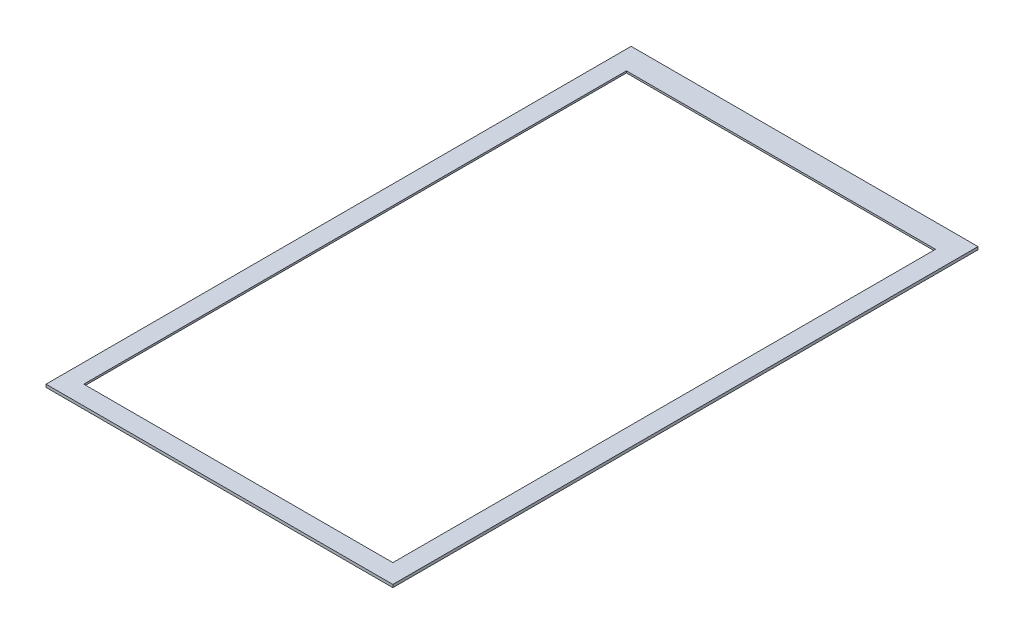
ISO-10303-21;
HEADER;
FILE_DESCRIPTION(('STEP AP214'),'2;1');
FILE_NAME('part.step','',(''),(''),'','','');
FILE_SCHEMA(('AUTOMOTIVE_DESIGN { 1 0 10303 214 1 1 1 1 }'));
ENDSEC;
DATA;
#1=APPLICATION_CONTEXT('core data for automotive mechanical design processes');
#2=APPLICATION_PROTOCOL_DEFINITION('international standard','automotive_design',2000,#1);
#3=PRODUCT_CONTEXT('',#1,'mechanical');
#4=PRODUCT('Part','Part','',(#3));
#5=PRODUCT_RELATED_PRODUCT_CATEGORY('part','',(#4));
#6=PRODUCT_DEFINITION_FORMATION('','',#4);
#7=PRODUCT_DEFINITION_CONTEXT('part definition',#1,'design');
#8=PRODUCT_DEFINITION('design','',#6,#7);
#9=PRODUCT_DEFINITION_SHAPE('','',#8);
#10=(LENGTH_UNIT() NAMED_UNIT(*) SI_UNIT(.MILLI.,.METRE.));
#11=(NAMED_UNIT(*) PLANE_ANGLE_UNIT() SI_UNIT($,.RADIAN.));
#12=(NAMED_UNIT(*) SI_UNIT($,.STERADIAN.) SOLID_ANGLE_UNIT());
#13=UNCERTAINTY_MEASURE_WITH_UNIT(LENGTH_MEASURE(1.E-05),#10,'distance_accuracy_value','');
#14=(GEOMETRIC_REPRESENTATION_CONTEXT(3) GLOBAL_UNCERTAINTY_ASSIGNED_CONTEXT((#13)) GLOBAL_UNIT_ASSIGNED_CONTEXT((#10,
#11,#12)) REPRESENTATION_CONTEXT('',''));
#15=CARTESIAN_POINT('',(0.,0.,0.));
#16=DIRECTION('',(0.,0.,1.));
#17=DIRECTION('',(1.,0.,0.));
#18=AXIS2_PLACEMENT_3D('',#15,#16,#17);
#19=CARTESIAN_POINT('',(327.5,6.,-570.));
#20=DIRECTION('',(-1.,0.,0.));
#21=DIRECTION('',(0.,0.,1.));
#22=AXIS2_PLACEMENT_3D('',#19,#20,#21);
#23=PLANE('',#22);
#24=DIRECTION('',(0.,-1.,0.));
#25=VECTOR('',#24,1.);
#26=CARTESIAN_POINT('',(327.5,6.,-570.));
#27=LINE('',#26,#25);
#28=CARTESIAN_POINT('',(327.5,6.,-570.));
#29=VERTEX_POINT('',#28);
#30=CARTESIAN_POINT('',(327.5,2.,-570.));
#31=VERTEX_POINT('',#30);
#32=EDGE_CURVE('E184',#29,#31,#27,.T.);
#33=ORIENTED_EDGE('',*,*,#32,.T.);
#34=DIRECTION('',(0.,0.,1.));
#35=VECTOR('',#34,1.);
#36=CARTESIAN_POINT('',(327.5,2.,-570.));
#37=LINE('',#36,#35);
#38=CARTESIAN_POINT('',(327.5,2.,580.));
#39=VERTEX_POINT('',#38);
#40=EDGE_CURVE('E163',#31,#39,#37,.T.);
#41=ORIENTED_EDGE('',*,*,#40,.T.);
#42=DIRECTION('',(0.,-1.,0.));
#43=VECTOR('',#42,1.);
#44=CARTESIAN_POINT('',(327.5,6.,580.));
#45=LINE('',#44,#43);
#46=CARTESIAN_POINT('',(327.5,6.,580.));
#47=VERTEX_POINT('',#46);
#48=EDGE_CURVE('E175',#47,#39,#45,.T.);
#49=ORIENTED_EDGE('',*,*,#48,.F.);
#50=DIRECTION('',(0.,0.,-1.));
#51=VECTOR('',#50,1.);
#52=CARTESIAN_POINT('',(327.5,6.,-570.));
#53=LINE('',#52,#51);
#54=EDGE_CURVE('E166',#47,#29,#53,.T.);
#55=ORIENTED_EDGE('',*,*,#54,.T.);
#56=EDGE_LOOP('',(#33,#41,#49,#55));
#57=FACE_BOUND('',#56,.T.);
#58=ADVANCED_FACE('F33',(#57),#23,.T.);
#59=CARTESIAN_POINT('',(-327.5,6.,-570.));
#60=DIRECTION('',(0.,0.,1.));
#61=DIRECTION('',(1.,0.,0.));
#62=AXIS2_PLACEMENT_3D('',#59,#60,#61);
#63=PLANE('',#62);
#64=DIRECTION('',(0.,-1.,0.));
#65=VECTOR('',#64,1.);
#66=CARTESIAN_POINT('',(-327.5,6.,-570.));
#67=LINE('',#66,#65);
#68=CARTESIAN_POINT('',(-327.5,6.,-570.));
#69=VERTEX_POINT('',#68);
#70=CARTESIAN_POINT('',(-327.5,2.,-570.));
#71=VERTEX_POINT('',#70);
#72=EDGE_CURVE('E181',#69,#71,#67,.T.);
#73=ORIENTED_EDGE('',*,*,#72,.T.);
#74=DIRECTION('',(1.,0.,0.));
#75=VECTOR('',#74,1.);
#76=CARTESIAN_POINT('',(-327.5,2.,-570.));
#77=LINE('',#76,#75);
#78=EDGE_CURVE('E160',#71,#31,#77,.T.);
#79=ORIENTED_EDGE('',*,*,#78,.T.);
#80=ORIENTED_EDGE('',*,*,#32,.F.);
#81=DIRECTION('',(-1.,0.,0.));
#82=VECTOR('',#81,1.);
#83=CARTESIAN_POINT('',(-327.5,6.,-570.));
#84=LINE('',#83,#82);
#85=EDGE_CURVE('E168',#29,#69,#84,.T.);
#86=ORIENTED_EDGE('',*,*,#85,.T.);
#87=EDGE_LOOP('',(#73,#79,#80,#86));
#88=FACE_BOUND('',#87,.T.);
#89=ADVANCED_FACE('F246',(#88),#63,.T.);
#90=CARTESIAN_POINT('',(-327.5,6.,-570.));
#91=DIRECTION('',(1.,0.,0.));
#92=DIRECTION('',(0.,0.,-1.));
#93=AXIS2_PLACEMENT_3D('',#90,#91,#92);
#94=PLANE('',#93);
#95=DIRECTION('',(0.,-1.,0.));
#96=VECTOR('',#95,1.);
#97=CARTESIAN_POINT('',(-327.5,6.,580.));
#98=LINE('',#97,#96);
#99=CARTESIAN_POINT('',(-327.5,6.,580.));
#100=VERTEX_POINT('',#99);
#101=CARTESIAN_POINT('',(-327.5,2.,580.));
#102=VERTEX_POINT('',#101);
#103=EDGE_CURVE('E178',#100,#102,#98,.T.);
#104=ORIENTED_EDGE('',*,*,#103,.T.);
#105=DIRECTION('',(0.,0.,-1.));
#106=VECTOR('',#105,1.);
#107=CARTESIAN_POINT('',(-327.5,2.,-570.));
#108=LINE('',#107,#106);
#109=EDGE_CURVE('E56',#102,#71,#108,.T.);
#110=ORIENTED_EDGE('',*,*,#109,.T.);
#111=ORIENTED_EDGE('',*,*,#72,.F.);
#112=DIRECTION('',(0.,0.,1.));
#113=VECTOR('',#112,1.);
#114=CARTESIAN_POINT('',(-327.5,6.,-570.));
#115=LINE('',#114,#113);
#116=EDGE_CURVE('E170',#69,#100,#115,.T.);
#117=ORIENTED_EDGE('',*,*,#116,.T.);
#118=EDGE_LOOP('',(#104,#110,#111,#117));
#119=FACE_BOUND('',#118,.T.);
#120=ADVANCED_FACE('F248',(#119),#94,.T.);
#121=CARTESIAN_POINT('',(-327.5,6.,580.));
#122=DIRECTION('',(0.,0.,-1.));
#123=DIRECTION('',(-1.,0.,0.));
#124=AXIS2_PLACEMENT_3D('',#121,#122,#123);
#125=PLANE('',#124);
#126=ORIENTED_EDGE('',*,*,#48,.T.);
#127=DIRECTION('',(-1.,0.,0.));
#128=VECTOR('',#127,1.);
#129=CARTESIAN_POINT('',(-327.5,2.,580.));
#130=LINE('',#129,#128);
#131=EDGE_CURVE('E11',#39,#102,#130,.T.);
#132=ORIENTED_EDGE('',*,*,#131,.T.);
#133=ORIENTED_EDGE('',*,*,#103,.F.);
#134=DIRECTION('',(1.,0.,0.));
#135=VECTOR('',#134,1.);
#136=CARTESIAN_POINT('',(-327.5,6.,580.));
#137=LINE('',#136,#135);
#138=EDGE_CURVE('E173',#100,#47,#137,.T.);
#139=ORIENTED_EDGE('',*,*,#138,.T.);
#140=EDGE_LOOP('',(#126,#132,#133,#139));
#141=FACE_BOUND('',#140,.T.);
#142=ADVANCED_FACE('F237',(#141),#125,.T.);
#143=CARTESIAN_POINT('',(0.,6.,0.));
#144=DIRECTION('',(0.,1.,0.));
#145=DIRECTION('',(0.,0.,1.));
#146=AXIS2_PLACEMENT_3D('',#143,#144,#145);
#147=PLANE('',#146);
#148=DIRECTION('',(0.,0.,-1.));
#149=VECTOR('',#148,1.);
#150=CARTESIAN_POINT('',(367.5,6.,-620.));
#151=LINE('',#150,#149);
#152=CARTESIAN_POINT('',(367.5,6.,620.));
#153=VERTEX_POINT('',#152);
#154=CARTESIAN_POINT('',(367.5,6.,-620.));
#155=VERTEX_POINT('',#154);
#156=EDGE_CURVE('E188',#153,#155,#151,.T.);
#157=ORIENTED_EDGE('',*,*,#156,.T.);
#158=DIRECTION('',(-1.,0.,0.));
#159=VECTOR('',#158,1.);
#160=CARTESIAN_POINT('',(-367.5,6.,-620.));
#161=LINE('',#160,#159);
#162=CARTESIAN_POINT('',(-367.5,6.,-620.));
#163=VERTEX_POINT('',#162);
#164=EDGE_CURVE('E191',#155,#163,#161,.T.);
#165=ORIENTED_EDGE('',*,*,#164,.T.);
#166=DIRECTION('',(0.,0.,1.));
#167=VECTOR('',#166,1.);
#168=CARTESIAN_POINT('',(-367.5,6.,-620.));
#169=LINE('',#168,#167);
#170=CARTESIAN_POINT('',(-367.5,6.,620.));
#171=VERTEX_POINT('',#170);
#172=EDGE_CURVE('E194',#163,#171,#169,.T.);
#173=ORIENTED_EDGE('',*,*,#172,.T.);
#174=DIRECTION('',(1.,0.,0.));
#175=VECTOR('',#174,1.);
#176=CARTESIAN_POINT('',(-367.5,6.,620.));
#177=LINE('',#176,#175);
#178=EDGE_CURVE('E196',#171,#153,#177,.T.);
#179=ORIENTED_EDGE('',*,*,#178,.T.);
#180=EDGE_LOOP('',(#157,#165,#173,#179));
#181=FACE_BOUND('',#180,.T.);
#182=ORIENTED_EDGE('',*,*,#85,.F.);
#183=ORIENTED_EDGE('',*,*,#54,.F.);
#184=ORIENTED_EDGE('',*,*,#138,.F.);
#185=ORIENTED_EDGE('',*,*,#116,.F.);
#186=EDGE_LOOP('',(#182,#183,#184,#185));
#187=FACE_BOUND('',#186,.T.);
#188=ADVANCED_FACE('F234',(#181,#187),#147,.T.);
#189=CARTESIAN_POINT('',(0.,0.,0.));
#190=DIRECTION('',(0.,1.,0.));
#191=DIRECTION('',(0.,0.,1.));
#192=AXIS2_PLACEMENT_3D('',#189,#190,#191);
#193=PLANE('',#192);
#194=DIRECTION('',(1.,0.,0.));
#195=VECTOR('',#194,1.);
#196=CARTESIAN_POINT('',(348.5,0.,-591.));
#197=LINE('',#196,#195);
#198=CARTESIAN_POINT('',(-348.5,0.,-591.000000000001));
#199=VERTEX_POINT('',#198);
#200=CARTESIAN_POINT('',(348.5,0.,-591.));
#201=VERTEX_POINT('',#200);
#202=EDGE_CURVE('E150',#199,#201,#197,.T.);
#203=ORIENTED_EDGE('',*,*,#202,.F.);
#204=DIRECTION('',(0.,0.,-1.));
#205=VECTOR('',#204,1.);
#206=CARTESIAN_POINT('',(-348.5,0.,-591.));
#207=LINE('',#206,#205);
#208=CARTESIAN_POINT('',(-348.5,0.,601.));
#209=VERTEX_POINT('',#208);
#210=EDGE_CURVE('E48',#209,#199,#207,.T.);
#211=ORIENTED_EDGE('',*,*,#210,.F.);
#212=DIRECTION('',(-1.,0.,0.));
#213=VECTOR('',#212,1.);
#214=CARTESIAN_POINT('',(348.5,0.,601.));
#215=LINE('',#214,#213);
#216=CARTESIAN_POINT('',(348.5,0.,601.));
#217=VERTEX_POINT('',#216);
#218=EDGE_CURVE('E141',#217,#209,#215,.T.);
#219=ORIENTED_EDGE('',*,*,#218,.F.);
#220=DIRECTION('',(0.,0.,1.));
#221=VECTOR('',#220,1.);
#222=CARTESIAN_POINT('',(348.5,0.,-591.));
#223=LINE('',#222,#221);
#224=EDGE_CURVE('E144',#201,#217,#223,.T.);
#225=ORIENTED_EDGE('',*,*,#224,.F.);
#226=EDGE_LOOP('',(#203,#211,#219,#225));
#227=FACE_BOUND('',#226,.T.);
#228=DIRECTION('',(0.,0.,-1.));
#229=VECTOR('',#228,1.);
#230=CARTESIAN_POINT('',(367.5,0.,-620.));
#231=LINE('',#230,#229);
#232=CARTESIAN_POINT('',(367.5,0.,620.));
#233=VERTEX_POINT('',#232);
#234=CARTESIAN_POINT('',(367.5,0.,-620.));
#235=VERTEX_POINT('',#234);
#236=EDGE_CURVE('E187',#233,#235,#231,.T.);
#237=ORIENTED_EDGE('',*,*,#236,.F.);
#238=DIRECTION('',(1.,0.,0.));
#239=VECTOR('',#238,1.);
#240=CARTESIAN_POINT('',(-367.5,0.,620.));
#241=LINE('',#240,#239);
#242=CARTESIAN_POINT('',(-367.5,0.,620.));
#243=VERTEX_POINT('',#242);
#244=EDGE_CURVE('E192',#243,#233,#241,.T.);
#245=ORIENTED_EDGE('',*,*,#244,.F.);
#246=DIRECTION('',(0.,0.,1.));
#247=VECTOR('',#246,1.);
#248=CARTESIAN_POINT('',(-367.5,0.,-620.));
#249=LINE('',#248,#247);
#250=CARTESIAN_POINT('',(-367.5,0.,-620.));
#251=VERTEX_POINT('',#250);
#252=EDGE_CURVE('E203',#251,#243,#249,.T.);
#253=ORIENTED_EDGE('',*,*,#252,.F.);
#254=DIRECTION('',(-1.,0.,0.));
#255=VECTOR('',#254,1.);
#256=CARTESIAN_POINT('',(-367.5,0.,-620.));
#257=LINE('',#256,#255);
#258=EDGE_CURVE('E201',#235,#251,#257,.T.);
#259=ORIENTED_EDGE('',*,*,#258,.F.);
#260=EDGE_LOOP('',(#237,#245,#253,#259));
#261=FACE_BOUND('',#260,.T.);
#262=ADVANCED_FACE('F224',(#227,#261),#193,.F.);
#263=CARTESIAN_POINT('',(367.5,6.,-620.));
#264=DIRECTION('',(-1.,0.,0.));
#265=DIRECTION('',(0.,0.,1.));
#266=AXIS2_PLACEMENT_3D('',#263,#264,#265);
#267=PLANE('',#266);
#268=ORIENTED_EDGE('',*,*,#236,.T.);
#269=DIRECTION('',(0.,-1.,0.));
#270=VECTOR('',#269,1.);
#271=CARTESIAN_POINT('',(367.5,6.,-620.));
#272=LINE('',#271,#270);
#273=EDGE_CURVE('E41',#155,#235,#272,.T.);
#274=ORIENTED_EDGE('',*,*,#273,.F.);
#275=ORIENTED_EDGE('',*,*,#156,.F.);
#276=DIRECTION('',(0.,-1.,0.));
#277=VECTOR('',#276,1.);
#278=CARTESIAN_POINT('',(367.5,6.,620.));
#279=LINE('',#278,#277);
#280=EDGE_CURVE('E198',#153,#233,#279,.T.);
#281=ORIENTED_EDGE('',*,*,#280,.T.);
#282=EDGE_LOOP('',(#268,#274,#275,#281));
#283=FACE_BOUND('',#282,.T.);
#284=ADVANCED_FACE('F35',(#283),#267,.F.);
#285=CARTESIAN_POINT('',(-367.5,6.,-620.));
#286=DIRECTION('',(0.,0.,1.));
#287=DIRECTION('',(1.,0.,0.));
#288=AXIS2_PLACEMENT_3D('',#285,#286,#287);
#289=PLANE('',#288);
#290=ORIENTED_EDGE('',*,*,#258,.T.);
#291=DIRECTION('',(0.,-1.,0.));
#292=VECTOR('',#291,1.);
#293=CARTESIAN_POINT('',(-367.5,6.,-620.));
#294=LINE('',#293,#292);
#295=EDGE_CURVE('E211',#163,#251,#294,.T.);
#296=ORIENTED_EDGE('',*,*,#295,.F.);
#297=ORIENTED_EDGE('',*,*,#164,.F.);
#298=ORIENTED_EDGE('',*,*,#273,.T.);
#299=EDGE_LOOP('',(#290,#296,#297,#298));
#300=FACE_BOUND('',#299,.T.);
#301=ADVANCED_FACE('F216',(#300),#289,.F.);
#302=CARTESIAN_POINT('',(-367.5,6.,-620.));
#303=DIRECTION('',(1.,0.,0.));
#304=DIRECTION('',(0.,0.,-1.));
#305=AXIS2_PLACEMENT_3D('',#302,#303,#304);
#306=PLANE('',#305);
#307=ORIENTED_EDGE('',*,*,#252,.T.);
#308=DIRECTION('',(0.,-1.,0.));
#309=VECTOR('',#308,1.);
#310=CARTESIAN_POINT('',(-367.5,6.,620.));
#311=LINE('',#310,#309);
#312=EDGE_CURVE('E208',#171,#243,#311,.T.);
#313=ORIENTED_EDGE('',*,*,#312,.F.);
#314=ORIENTED_EDGE('',*,*,#172,.F.);
#315=ORIENTED_EDGE('',*,*,#295,.T.);
#316=EDGE_LOOP('',(#307,#313,#314,#315));
#317=FACE_BOUND('',#316,.T.);
#318=ADVANCED_FACE('F228',(#317),#306,.F.);
#319=CARTESIAN_POINT('',(-367.5,6.,620.));
#320=DIRECTION('',(0.,0.,-1.));
#321=DIRECTION('',(-1.,0.,0.));
#322=AXIS2_PLACEMENT_3D('',#319,#320,#321);
#323=PLANE('',#322);
#324=ORIENTED_EDGE('',*,*,#244,.T.);
#325=ORIENTED_EDGE('',*,*,#280,.F.);
#326=ORIENTED_EDGE('',*,*,#178,.F.);
#327=ORIENTED_EDGE('',*,*,#312,.T.);
#328=EDGE_LOOP('',(#324,#325,#326,#327));
#329=FACE_BOUND('',#328,.T.);
#330=ADVANCED_FACE('F232',(#329),#323,.F.);
#331=CARTESIAN_POINT('',(-348.5,2.,-591.));
#332=DIRECTION('',(-1.,0.,0.));
#333=DIRECTION('',(0.,0.,1.));
#334=AXIS2_PLACEMENT_3D('',#331,#332,#333);
#335=PLANE('',#334);
#336=ORIENTED_EDGE('',*,*,#210,.T.);
#337=DIRECTION('',(0.,-1.,0.));
#338=VECTOR('',#337,1.);
#339=CARTESIAN_POINT('',(-348.5,2.,-591.));
#340=LINE('',#339,#338);
#341=CARTESIAN_POINT('',(-348.5,2.,-591.));
#342=VERTEX_POINT('',#341);
#343=EDGE_CURVE('E119',#342,#199,#340,.T.);
#344=ORIENTED_EDGE('',*,*,#343,.F.);
#345=DIRECTION('',(0.,0.,-1.));
#346=VECTOR('',#345,1.);
#347=CARTESIAN_POINT('',(-348.5,2.,-591.));
#348=LINE('',#347,#346);
#349=CARTESIAN_POINT('',(-348.5,2.,601.));
#350=VERTEX_POINT('',#349);
#351=EDGE_CURVE('E123',#350,#342,#348,.T.);
#352=ORIENTED_EDGE('',*,*,#351,.F.);
#353=DIRECTION('',(0.,-1.,0.));
#354=VECTOR('',#353,1.);
#355=CARTESIAN_POINT('',(-348.5,2.,601.));
#356=LINE('',#355,#354);
#357=EDGE_CURVE('E154',#350,#209,#356,.T.);
#358=ORIENTED_EDGE('',*,*,#357,.T.);
#359=EDGE_LOOP('',(#336,#344,#352,#358));
#360=FACE_BOUND('',#359,.T.);
#361=ADVANCED_FACE('F121',(#360),#335,.F.);
#362=CARTESIAN_POINT('',(348.5,2.,601.));
#363=DIRECTION('',(0.,0.,1.));
#364=DIRECTION('',(1.,0.,0.));
#365=AXIS2_PLACEMENT_3D('',#362,#363,#364);
#366=PLANE('',#365);
#367=ORIENTED_EDGE('',*,*,#218,.T.);
#368=ORIENTED_EDGE('',*,*,#357,.F.);
#369=DIRECTION('',(-1.,0.,0.));
#370=VECTOR('',#369,1.);
#371=CARTESIAN_POINT('',(348.5,2.,601.));
#372=LINE('',#371,#370);
#373=CARTESIAN_POINT('',(348.5,2.,601.));
#374=VERTEX_POINT('',#373);
#375=EDGE_CURVE('E129',#374,#350,#372,.T.);
#376=ORIENTED_EDGE('',*,*,#375,.F.);
#377=DIRECTION('',(0.,-1.,0.));
#378=VECTOR('',#377,1.);
#379=CARTESIAN_POINT('',(348.5,2.,601.));
#380=LINE('',#379,#378);
#381=EDGE_CURVE('E156',#374,#217,#380,.T.);
#382=ORIENTED_EDGE('',*,*,#381,.T.);
#383=EDGE_LOOP('',(#367,#368,#376,#382));
#384=FACE_BOUND('',#383,.T.);
#385=ADVANCED_FACE('F330',(#384),#366,.F.);
#386=CARTESIAN_POINT('',(348.5,2.,-591.));
#387=DIRECTION('',(1.,0.,0.));
#388=DIRECTION('',(0.,0.,-1.));
#389=AXIS2_PLACEMENT_3D('',#386,#387,#388);
#390=PLANE('',#389);
#391=ORIENTED_EDGE('',*,*,#224,.T.);
#392=ORIENTED_EDGE('',*,*,#381,.F.);
#393=DIRECTION('',(0.,0.,1.));
#394=VECTOR('',#393,1.);
#395=CARTESIAN_POINT('',(348.5,2.,-591.));
#396=LINE('',#395,#394);
#397=CARTESIAN_POINT('',(348.5,2.,-591.));
#398=VERTEX_POINT('',#397);
#399=EDGE_CURVE('E137',#398,#374,#396,.T.);
#400=ORIENTED_EDGE('',*,*,#399,.F.);
#401=DIRECTION('',(0.,-1.,0.));
#402=VECTOR('',#401,1.);
#403=CARTESIAN_POINT('',(348.5,2.,-591.));
#404=LINE('',#403,#402);
#405=EDGE_CURVE('E128',#398,#201,#404,.T.);
#406=ORIENTED_EDGE('',*,*,#405,.T.);
#407=EDGE_LOOP('',(#391,#392,#400,#406));
#408=FACE_BOUND('',#407,.T.);
#409=ADVANCED_FACE('F336',(#408),#390,.F.);
#410=CARTESIAN_POINT('',(348.5,2.,-591.));
#411=DIRECTION('',(0.,0.,-1.));
#412=DIRECTION('',(-1.,0.,0.));
#413=AXIS2_PLACEMENT_3D('',#410,#411,#412);
#414=PLANE('',#413);
#415=ORIENTED_EDGE('',*,*,#202,.T.);
#416=ORIENTED_EDGE('',*,*,#405,.F.);
#417=DIRECTION('',(1.,0.,0.));
#418=VECTOR('',#417,1.);
#419=CARTESIAN_POINT('',(348.5,2.,-591.));
#420=LINE('',#419,#418);
#421=EDGE_CURVE('E132',#342,#398,#420,.T.);
#422=ORIENTED_EDGE('',*,*,#421,.F.);
#423=ORIENTED_EDGE('',*,*,#343,.T.);
#424=EDGE_LOOP('',(#415,#416,#422,#423));
#425=FACE_BOUND('',#424,.T.);
#426=ADVANCED_FACE('F133',(#425),#414,.F.);
#427=CARTESIAN_POINT('',(0.,2.,0.));
#428=DIRECTION('',(0.,-1.,0.));
#429=DIRECTION('',(0.,0.,-1.));
#430=AXIS2_PLACEMENT_3D('',#427,#428,#429);
#431=PLANE('',#430);
#432=ORIENTED_EDGE('',*,*,#78,.F.);
#433=ORIENTED_EDGE('',*,*,#109,.F.);
#434=ORIENTED_EDGE('',*,*,#131,.F.);
#435=ORIENTED_EDGE('',*,*,#40,.F.);
#436=EDGE_LOOP('',(#432,#433,#434,#435));
#437=FACE_BOUND('',#436,.T.);
#438=ORIENTED_EDGE('',*,*,#351,.T.);
#439=ORIENTED_EDGE('',*,*,#421,.T.);
#440=ORIENTED_EDGE('',*,*,#399,.T.);
#441=ORIENTED_EDGE('',*,*,#375,.T.);
#442=EDGE_LOOP('',(#438,#439,#440,#441));
#443=FACE_BOUND('',#442,.T.);
#444=ADVANCED_FACE('F139',(#437,#443),#431,.T.);
#445=CLOSED_SHELL('',(#58,#89,#120,#142,#188,#262,#284,#301,#318,#330,#361,#385,#409,#426,#444));
#446=MANIFOLD_SOLID_BREP('B2',#445);
#447=ADVANCED_BREP_SHAPE_REPRESENTATION('',(#18,#446),#14);
#448=SHAPE_DEFINITION_REPRESENTATION(#9,#447);
ENDSEC;
END-ISO-10303-21;
